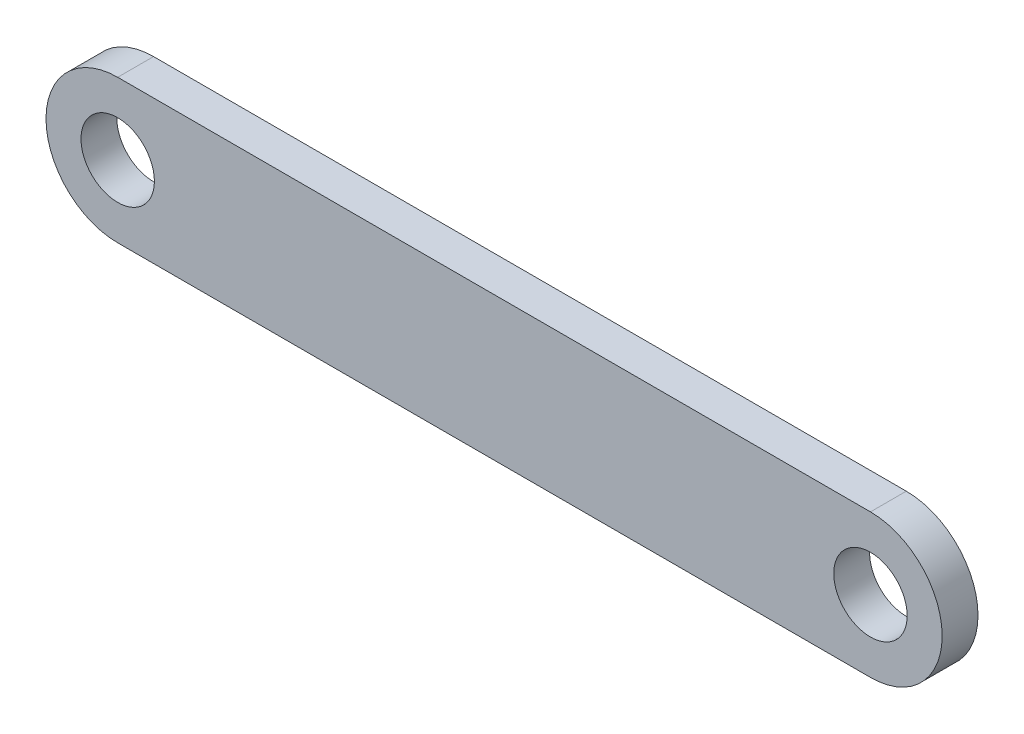
ISO-10303-21;
HEADER;
FILE_DESCRIPTION(('STEP AP214'),'2;1');
FILE_NAME('part.step','',(''),(''),'','','');
FILE_SCHEMA(('AUTOMOTIVE_DESIGN { 1 0 10303 214 1 1 1 1 }'));
ENDSEC;
DATA;
#1=APPLICATION_CONTEXT('core data for automotive mechanical design processes');
#2=APPLICATION_PROTOCOL_DEFINITION('international standard','automotive_design',2000,#1);
#3=PRODUCT_CONTEXT('',#1,'mechanical');
#4=PRODUCT('Part','Part','',(#3));
#5=PRODUCT_RELATED_PRODUCT_CATEGORY('part','',(#4));
#6=PRODUCT_DEFINITION_FORMATION('','',#4);
#7=PRODUCT_DEFINITION_CONTEXT('part definition',#1,'design');
#8=PRODUCT_DEFINITION('design','',#6,#7);
#9=PRODUCT_DEFINITION_SHAPE('','',#8);
#10=(LENGTH_UNIT() NAMED_UNIT(*) SI_UNIT(.MILLI.,.METRE.));
#11=(NAMED_UNIT(*) PLANE_ANGLE_UNIT() SI_UNIT($,.RADIAN.));
#12=(NAMED_UNIT(*) SI_UNIT($,.STERADIAN.) SOLID_ANGLE_UNIT());
#13=UNCERTAINTY_MEASURE_WITH_UNIT(LENGTH_MEASURE(1.E-05),#10,'distance_accuracy_value','');
#14=(GEOMETRIC_REPRESENTATION_CONTEXT(3) GLOBAL_UNCERTAINTY_ASSIGNED_CONTEXT((#13)) GLOBAL_UNIT_ASSIGNED_CONTEXT((#10,
#11,#12)) REPRESENTATION_CONTEXT('',''));
#15=CARTESIAN_POINT('',(0.,0.,0.));
#16=DIRECTION('',(0.,0.,1.));
#17=DIRECTION('',(1.,0.,0.));
#18=AXIS2_PLACEMENT_3D('',#15,#16,#17);
#19=CARTESIAN_POINT('',(0.,0.,3.175));
#20=DIRECTION('',(0.,0.,1.));
#21=DIRECTION('',(1.,0.,0.));
#22=AXIS2_PLACEMENT_3D('',#19,#20,#21);
#23=PLANE('',#22);
#24=CARTESIAN_POINT('',(0.,0.,3.175));
#25=DIRECTION('',(0.,0.,1.));
#26=DIRECTION('',(1.,0.,0.));
#27=AXIS2_PLACEMENT_3D('',#24,#25,#26);
#28=CIRCLE('',#27,3.2512);
#29=CARTESIAN_POINT('',(3.2512,0.,3.175));
#30=VERTEX_POINT('',#29);
#31=EDGE_CURVE('E100',#30,#30,#28,.T.);
#32=ORIENTED_EDGE('',*,*,#31,.F.);
#33=EDGE_LOOP('',(#32));
#34=FACE_BOUND('',#33,.T.);
#35=CARTESIAN_POINT('',(0.,0.,3.175));
#36=DIRECTION('',(0.,0.,1.));
#37=DIRECTION('',(1.,0.,0.));
#38=AXIS2_PLACEMENT_3D('',#35,#36,#37);
#39=CIRCLE('',#38,6.35);
#40=CARTESIAN_POINT('',(0.,6.35,3.175));
#41=VERTEX_POINT('',#40);
#42=CARTESIAN_POINT('',(0.,-6.35,3.175));
#43=VERTEX_POINT('',#42);
#44=EDGE_CURVE('E85',#41,#43,#39,.T.);
#45=ORIENTED_EDGE('',*,*,#44,.T.);
#46=DIRECTION('',(1.,0.,0.));
#47=VECTOR('',#46,1.);
#48=CARTESIAN_POINT('',(0.,-6.35,3.175));
#49=LINE('',#48,#47);
#50=CARTESIAN_POINT('',(66.675,-6.35,3.175));
#51=VERTEX_POINT('',#50);
#52=EDGE_CURVE('E80',#43,#51,#49,.T.);
#53=ORIENTED_EDGE('',*,*,#52,.T.);
#54=CARTESIAN_POINT('',(66.675,0.,3.175));
#55=DIRECTION('',(0.,0.,1.));
#56=DIRECTION('',(1.,0.,0.));
#57=AXIS2_PLACEMENT_3D('',#54,#55,#56);
#58=CIRCLE('',#57,6.35);
#59=CARTESIAN_POINT('',(66.675,6.35,3.175));
#60=VERTEX_POINT('',#59);
#61=EDGE_CURVE('E83',#51,#60,#58,.T.);
#62=ORIENTED_EDGE('',*,*,#61,.T.);
#63=DIRECTION('',(-1.,0.,0.));
#64=VECTOR('',#63,1.);
#65=CARTESIAN_POINT('',(0.,6.35,3.175));
#66=LINE('',#65,#64);
#67=EDGE_CURVE('E50',#60,#41,#66,.T.);
#68=ORIENTED_EDGE('',*,*,#67,.T.);
#69=EDGE_LOOP('',(#45,#53,#62,#68));
#70=FACE_BOUND('',#69,.T.);
#71=CARTESIAN_POINT('',(66.675,0.,3.175));
#72=DIRECTION('',(0.,0.,1.));
#73=DIRECTION('',(1.,0.,0.));
#74=AXIS2_PLACEMENT_3D('',#71,#72,#73);
#75=CIRCLE('',#74,3.25119999999999);
#76=CARTESIAN_POINT('',(69.9262,0.,3.175));
#77=VERTEX_POINT('',#76);
#78=EDGE_CURVE('E115',#77,#77,#75,.T.);
#79=ORIENTED_EDGE('',*,*,#78,.F.);
#80=EDGE_LOOP('',(#79));
#81=FACE_BOUND('',#80,.T.);
#82=ADVANCED_FACE('F33',(#34,#70,#81),#23,.T.);
#83=CARTESIAN_POINT('',(0.,0.,0.));
#84=DIRECTION('',(0.,0.,1.));
#85=DIRECTION('',(1.,0.,0.));
#86=AXIS2_PLACEMENT_3D('',#83,#84,#85);
#87=PLANE('',#86);
#88=CARTESIAN_POINT('',(0.,0.,0.));
#89=DIRECTION('',(0.,0.,1.));
#90=DIRECTION('',(1.,0.,0.));
#91=AXIS2_PLACEMENT_3D('',#88,#89,#90);
#92=CIRCLE('',#91,6.35);
#93=CARTESIAN_POINT('',(0.,6.35,0.));
#94=VERTEX_POINT('',#93);
#95=CARTESIAN_POINT('',(0.,-6.35,0.));
#96=VERTEX_POINT('',#95);
#97=EDGE_CURVE('E97',#94,#96,#92,.T.);
#98=ORIENTED_EDGE('',*,*,#97,.F.);
#99=DIRECTION('',(-1.,0.,0.));
#100=VECTOR('',#99,1.);
#101=CARTESIAN_POINT('',(0.,6.35,0.));
#102=LINE('',#101,#100);
#103=CARTESIAN_POINT('',(66.675,6.35,0.));
#104=VERTEX_POINT('',#103);
#105=EDGE_CURVE('E73',#104,#94,#102,.T.);
#106=ORIENTED_EDGE('',*,*,#105,.F.);
#107=CARTESIAN_POINT('',(66.675,0.,0.));
#108=DIRECTION('',(0.,0.,1.));
#109=DIRECTION('',(1.,0.,0.));
#110=AXIS2_PLACEMENT_3D('',#107,#108,#109);
#111=CIRCLE('',#110,6.35);
#112=CARTESIAN_POINT('',(66.675,-6.35,0.));
#113=VERTEX_POINT('',#112);
#114=EDGE_CURVE('E67',#113,#104,#111,.T.);
#115=ORIENTED_EDGE('',*,*,#114,.F.);
#116=DIRECTION('',(1.,0.,0.));
#117=VECTOR('',#116,1.);
#118=CARTESIAN_POINT('',(0.,-6.35,0.));
#119=LINE('',#118,#117);
#120=EDGE_CURVE('E89',#96,#113,#119,.T.);
#121=ORIENTED_EDGE('',*,*,#120,.F.);
#122=EDGE_LOOP('',(#98,#106,#115,#121));
#123=FACE_BOUND('',#122,.T.);
#124=CARTESIAN_POINT('',(0.,0.,0.));
#125=DIRECTION('',(0.,0.,1.));
#126=DIRECTION('',(1.,0.,0.));
#127=AXIS2_PLACEMENT_3D('',#124,#125,#126);
#128=CIRCLE('',#127,3.2512);
#129=CARTESIAN_POINT('',(3.2512,0.,0.));
#130=VERTEX_POINT('',#129);
#131=EDGE_CURVE('E112',#130,#130,#128,.T.);
#132=ORIENTED_EDGE('',*,*,#131,.T.);
#133=EDGE_LOOP('',(#132));
#134=FACE_BOUND('',#133,.T.);
#135=CARTESIAN_POINT('',(66.675,0.,0.));
#136=DIRECTION('',(0.,0.,1.));
#137=DIRECTION('',(1.,0.,0.));
#138=AXIS2_PLACEMENT_3D('',#135,#136,#137);
#139=CIRCLE('',#138,3.25119999999999);
#140=CARTESIAN_POINT('',(69.9262,0.,0.));
#141=VERTEX_POINT('',#140);
#142=EDGE_CURVE('E118',#141,#141,#139,.T.);
#143=ORIENTED_EDGE('',*,*,#142,.T.);
#144=EDGE_LOOP('',(#143));
#145=FACE_BOUND('',#144,.T.);
#146=ADVANCED_FACE('F108',(#123,#134,#145),#87,.F.);
#147=CARTESIAN_POINT('',(0.,0.,3.175));
#148=DIRECTION('',(0.,0.,-1.));
#149=DIRECTION('',(-1.,0.,0.));
#150=AXIS2_PLACEMENT_3D('',#147,#148,#149);
#151=CYLINDRICAL_SURFACE('',#150,6.35);
#152=ORIENTED_EDGE('',*,*,#97,.T.);
#153=DIRECTION('',(0.,0.,-1.));
#154=VECTOR('',#153,1.);
#155=CARTESIAN_POINT('',(0.,-6.35,3.175));
#156=LINE('',#155,#154);
#157=EDGE_CURVE('E11',#43,#96,#156,.T.);
#158=ORIENTED_EDGE('',*,*,#157,.F.);
#159=ORIENTED_EDGE('',*,*,#44,.F.);
#160=DIRECTION('',(0.,0.,-1.));
#161=VECTOR('',#160,1.);
#162=CARTESIAN_POINT('',(0.,6.35,3.175));
#163=LINE('',#162,#161);
#164=EDGE_CURVE('E93',#41,#94,#163,.T.);
#165=ORIENTED_EDGE('',*,*,#164,.T.);
#166=EDGE_LOOP('',(#152,#158,#159,#165));
#167=FACE_BOUND('',#166,.T.);
#168=ADVANCED_FACE('F35',(#167),#151,.T.);
#169=CARTESIAN_POINT('',(0.,-6.35,3.175));
#170=DIRECTION('',(0.,1.,0.));
#171=DIRECTION('',(0.,0.,1.));
#172=AXIS2_PLACEMENT_3D('',#169,#170,#171);
#173=PLANE('',#172);
#174=ORIENTED_EDGE('',*,*,#120,.T.);
#175=DIRECTION('',(0.,0.,-1.));
#176=VECTOR('',#175,1.);
#177=CARTESIAN_POINT('',(66.675,-6.35,3.175));
#178=LINE('',#177,#176);
#179=EDGE_CURVE('E42',#51,#113,#178,.T.);
#180=ORIENTED_EDGE('',*,*,#179,.F.);
#181=ORIENTED_EDGE('',*,*,#52,.F.);
#182=ORIENTED_EDGE('',*,*,#157,.T.);
#183=EDGE_LOOP('',(#174,#180,#181,#182));
#184=FACE_BOUND('',#183,.T.);
#185=ADVANCED_FACE('F88',(#184),#173,.F.);
#186=CARTESIAN_POINT('',(66.675,0.,3.175));
#187=DIRECTION('',(0.,0.,-1.));
#188=DIRECTION('',(-1.,0.,0.));
#189=AXIS2_PLACEMENT_3D('',#186,#187,#188);
#190=CYLINDRICAL_SURFACE('',#189,6.35);
#191=ORIENTED_EDGE('',*,*,#114,.T.);
#192=DIRECTION('',(0.,0.,-1.));
#193=VECTOR('',#192,1.);
#194=CARTESIAN_POINT('',(66.675,6.35,3.175));
#195=LINE('',#194,#193);
#196=EDGE_CURVE('E90',#60,#104,#195,.T.);
#197=ORIENTED_EDGE('',*,*,#196,.F.);
#198=ORIENTED_EDGE('',*,*,#61,.F.);
#199=ORIENTED_EDGE('',*,*,#179,.T.);
#200=EDGE_LOOP('',(#191,#197,#198,#199));
#201=FACE_BOUND('',#200,.T.);
#202=ADVANCED_FACE('F91',(#201),#190,.T.);
#203=CARTESIAN_POINT('',(0.,6.35,3.175));
#204=DIRECTION('',(0.,-1.,0.));
#205=DIRECTION('',(0.,0.,-1.));
#206=AXIS2_PLACEMENT_3D('',#203,#204,#205);
#207=PLANE('',#206);
#208=ORIENTED_EDGE('',*,*,#105,.T.);
#209=ORIENTED_EDGE('',*,*,#164,.F.);
#210=ORIENTED_EDGE('',*,*,#67,.F.);
#211=ORIENTED_EDGE('',*,*,#196,.T.);
#212=EDGE_LOOP('',(#208,#209,#210,#211));
#213=FACE_BOUND('',#212,.T.);
#214=ADVANCED_FACE('F105',(#213),#207,.F.);
#215=CARTESIAN_POINT('',(0.,0.,3.175));
#216=DIRECTION('',(0.,0.,-1.));
#217=DIRECTION('',(-1.,0.,0.));
#218=AXIS2_PLACEMENT_3D('',#215,#216,#217);
#219=CYLINDRICAL_SURFACE('',#218,3.2512);
#220=ORIENTED_EDGE('',*,*,#31,.T.);
#221=EDGE_LOOP('',(#220));
#222=FACE_BOUND('',#221,.T.);
#223=ORIENTED_EDGE('',*,*,#131,.F.);
#224=EDGE_LOOP('',(#223));
#225=FACE_BOUND('',#224,.T.);
#226=ADVANCED_FACE('F135',(#222,#225),#219,.F.);
#227=CARTESIAN_POINT('',(66.675,0.,3.175));
#228=DIRECTION('',(0.,0.,-1.));
#229=DIRECTION('',(-1.,0.,0.));
#230=AXIS2_PLACEMENT_3D('',#227,#228,#229);
#231=CYLINDRICAL_SURFACE('',#230,3.25119999999999);
#232=ORIENTED_EDGE('',*,*,#78,.T.);
#233=EDGE_LOOP('',(#232));
#234=FACE_BOUND('',#233,.T.);
#235=ORIENTED_EDGE('',*,*,#142,.F.);
#236=EDGE_LOOP('',(#235));
#237=FACE_BOUND('',#236,.T.);
#238=ADVANCED_FACE('F124',(#234,#237),#231,.F.);
#239=CLOSED_SHELL('',(#82,#146,#168,#185,#202,#214,#226,#238));
#240=MANIFOLD_SOLID_BREP('B2',#239);
#241=ADVANCED_BREP_SHAPE_REPRESENTATION('',(#18,#240),#14);
#242=SHAPE_DEFINITION_REPRESENTATION(#9,#241);
ENDSEC;
END-ISO-10303-21;
